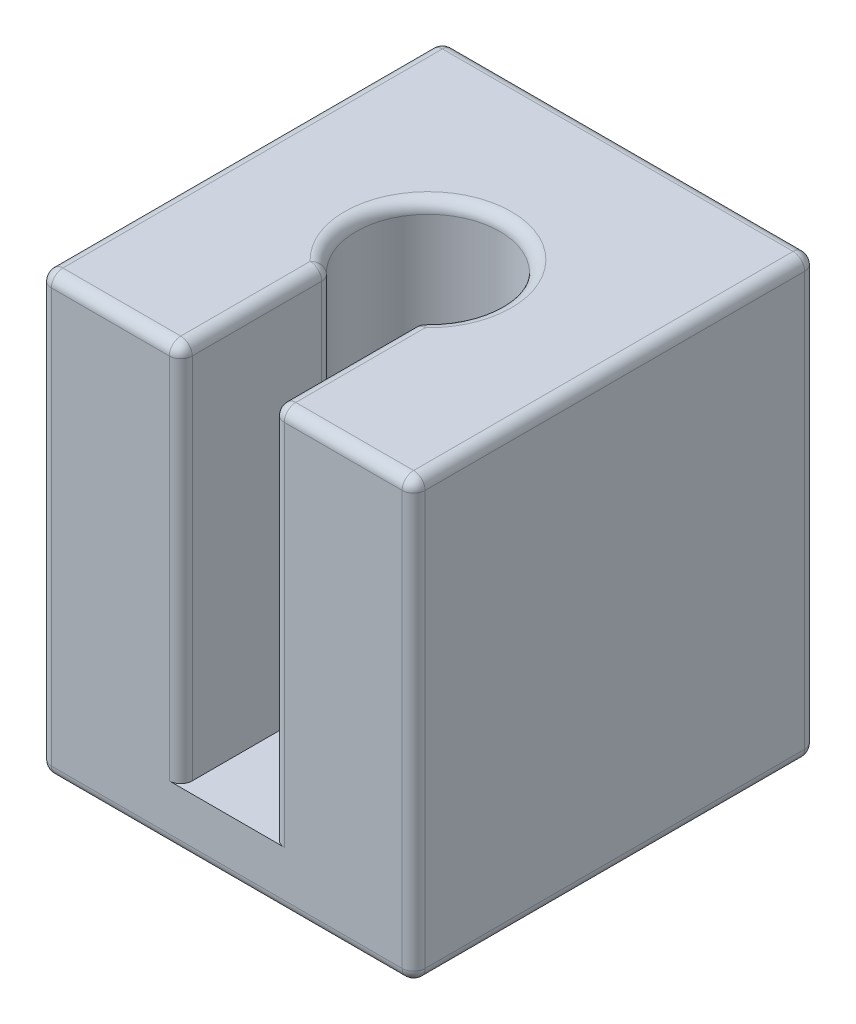
ISO-10303-21;
HEADER;
FILE_DESCRIPTION(('STEP AP214'),'2;1');
FILE_NAME('part.step','',(''),(''),'','','');
FILE_SCHEMA(('AUTOMOTIVE_DESIGN { 1 0 10303 214 1 1 1 1 }'));
ENDSEC;
DATA;
#1=APPLICATION_CONTEXT('core data for automotive mechanical design processes');
#2=APPLICATION_PROTOCOL_DEFINITION('international standard','automotive_design',2000,#1);
#3=PRODUCT_CONTEXT('',#1,'mechanical');
#4=PRODUCT('Part','Part','',(#3));
#5=PRODUCT_RELATED_PRODUCT_CATEGORY('part','',(#4));
#6=PRODUCT_DEFINITION_FORMATION('','',#4);
#7=PRODUCT_DEFINITION_CONTEXT('part definition',#1,'design');
#8=PRODUCT_DEFINITION('design','',#6,#7);
#9=PRODUCT_DEFINITION_SHAPE('','',#8);
#10=(LENGTH_UNIT() NAMED_UNIT(*) SI_UNIT(.MILLI.,.METRE.));
#11=(NAMED_UNIT(*) PLANE_ANGLE_UNIT() SI_UNIT($,.RADIAN.));
#12=(NAMED_UNIT(*) SI_UNIT($,.STERADIAN.) SOLID_ANGLE_UNIT());
#13=UNCERTAINTY_MEASURE_WITH_UNIT(LENGTH_MEASURE(1.E-05),#10,'distance_accuracy_value','');
#14=(GEOMETRIC_REPRESENTATION_CONTEXT(3) GLOBAL_UNCERTAINTY_ASSIGNED_CONTEXT((#13)) GLOBAL_UNIT_ASSIGNED_CONTEXT((#10,
#11,#12)) REPRESENTATION_CONTEXT('',''));
#15=CARTESIAN_POINT('',(0.,0.,0.));
#16=DIRECTION('',(0.,0.,1.));
#17=DIRECTION('',(1.,0.,0.));
#18=AXIS2_PLACEMENT_3D('',#15,#16,#17);
#19=CARTESIAN_POINT('',(0.,76.,0.));
#20=DIRECTION('',(1.,0.,0.));
#21=DIRECTION('',(0.,0.,-1.));
#22=AXIS2_PLACEMENT_3D('',#19,#20,#21);
#23=PLANE('',#22);
#24=DIRECTION('',(0.,-1.,0.));
#25=VECTOR('',#24,1.);
#26=CARTESIAN_POINT('',(0.,76.,-2.));
#27=LINE('',#26,#25);
#28=CARTESIAN_POINT('',(0.,2.,-2.));
#29=VERTEX_POINT('',#28);
#30=CARTESIAN_POINT('',(0.,74.,-2.));
#31=VERTEX_POINT('',#30);
#32=EDGE_CURVE('E289',#29,#31,#27,.F.);
#33=ORIENTED_EDGE('',*,*,#32,.T.);
#34=DIRECTION('',(0.,0.,1.));
#35=VECTOR('',#34,1.);
#36=CARTESIAN_POINT('',(0.,74.,0.));
#37=LINE('',#36,#35);
#38=CARTESIAN_POINT('',(0.,74.,-68.));
#39=VERTEX_POINT('',#38);
#40=EDGE_CURVE('E298',#31,#39,#37,.F.);
#41=ORIENTED_EDGE('',*,*,#40,.T.);
#42=DIRECTION('',(0.,-1.,0.));
#43=VECTOR('',#42,1.);
#44=CARTESIAN_POINT('',(0.,76.,-68.));
#45=LINE('',#44,#43);
#46=CARTESIAN_POINT('',(0.,2.,-68.));
#47=VERTEX_POINT('',#46);
#48=EDGE_CURVE('E295',#39,#47,#45,.T.);
#49=ORIENTED_EDGE('',*,*,#48,.T.);
#50=DIRECTION('',(0.,0.,1.));
#51=VECTOR('',#50,1.);
#52=CARTESIAN_POINT('',(0.,2.,0.));
#53=LINE('',#52,#51);
#54=EDGE_CURVE('E292',#47,#29,#53,.T.);
#55=ORIENTED_EDGE('',*,*,#54,.T.);
#56=EDGE_LOOP('',(#33,#41,#49,#55));
#57=FACE_BOUND('',#56,.T.);
#58=ADVANCED_FACE('F45',(#57),#23,.F.);
#59=CARTESIAN_POINT('',(0.,76.,0.));
#60=DIRECTION('',(0.,0.,-1.));
#61=DIRECTION('',(-1.,0.,0.));
#62=AXIS2_PLACEMENT_3D('',#59,#60,#61);
#63=PLANE('',#62);
#64=DIRECTION('',(1.,0.,0.));
#65=VECTOR('',#64,1.);
#66=CARTESIAN_POINT('',(24.5,9.99999999999999,0.));
#67=LINE('',#66,#65);
#68=CARTESIAN_POINT('',(22.5,9.99999999999999,0.));
#69=VERTEX_POINT('',#68);
#70=CARTESIAN_POINT('',(42.5,9.99999999999999,0.));
#71=VERTEX_POINT('',#70);
#72=EDGE_CURVE('E223',#69,#71,#67,.T.);
#73=ORIENTED_EDGE('',*,*,#72,.F.);
#74=DIRECTION('',(0.,1.,0.));
#75=VECTOR('',#74,1.);
#76=CARTESIAN_POINT('',(22.5,76.,0.));
#77=LINE('',#76,#75);
#78=CARTESIAN_POINT('',(22.5,74.,0.));
#79=VERTEX_POINT('',#78);
#80=EDGE_CURVE('E286',#69,#79,#77,.T.);
#81=ORIENTED_EDGE('',*,*,#80,.T.);
#82=DIRECTION('',(1.,0.,0.));
#83=VECTOR('',#82,1.);
#84=CARTESIAN_POINT('',(0.,74.,0.));
#85=LINE('',#84,#83);
#86=CARTESIAN_POINT('',(2.,74.,0.));
#87=VERTEX_POINT('',#86);
#88=EDGE_CURVE('E279',#79,#87,#85,.F.);
#89=ORIENTED_EDGE('',*,*,#88,.T.);
#90=DIRECTION('',(0.,-1.,0.));
#91=VECTOR('',#90,1.);
#92=CARTESIAN_POINT('',(2.,76.,0.));
#93=LINE('',#92,#91);
#94=CARTESIAN_POINT('',(2.,2.,0.));
#95=VERTEX_POINT('',#94);
#96=EDGE_CURVE('E273',#87,#95,#93,.T.);
#97=ORIENTED_EDGE('',*,*,#96,.T.);
#98=DIRECTION('',(1.,0.,0.));
#99=VECTOR('',#98,1.);
#100=CARTESIAN_POINT('',(65.,2.,0.));
#101=LINE('',#100,#99);
#102=CARTESIAN_POINT('',(63.,2.,0.));
#103=VERTEX_POINT('',#102);
#104=EDGE_CURVE('E269',#95,#103,#101,.T.);
#105=ORIENTED_EDGE('',*,*,#104,.T.);
#106=DIRECTION('',(0.,-1.,0.));
#107=VECTOR('',#106,1.);
#108=CARTESIAN_POINT('',(63.,76.,0.));
#109=LINE('',#108,#107);
#110=CARTESIAN_POINT('',(63.,74.,0.));
#111=VERTEX_POINT('',#110);
#112=EDGE_CURVE('E266',#103,#111,#109,.F.);
#113=ORIENTED_EDGE('',*,*,#112,.T.);
#114=DIRECTION('',(1.,0.,0.));
#115=VECTOR('',#114,1.);
#116=CARTESIAN_POINT('',(0.,74.,0.));
#117=LINE('',#116,#115);
#118=CARTESIAN_POINT('',(42.5,74.,0.));
#119=VERTEX_POINT('',#118);
#120=EDGE_CURVE('E276',#111,#119,#117,.F.);
#121=ORIENTED_EDGE('',*,*,#120,.T.);
#122=DIRECTION('',(0.,1.,0.));
#123=VECTOR('',#122,1.);
#124=CARTESIAN_POINT('',(42.5,76.,0.));
#125=LINE('',#124,#123);
#126=EDGE_CURVE('E282',#119,#71,#125,.F.);
#127=ORIENTED_EDGE('',*,*,#126,.T.);
#128=EDGE_LOOP('',(#73,#81,#89,#97,#105,#113,#121,#127));
#129=FACE_BOUND('',#128,.T.);
#130=ADVANCED_FACE('F558',(#129),#63,.F.);
#131=CARTESIAN_POINT('',(65.,76.,0.));
#132=DIRECTION('',(-1.,0.,0.));
#133=DIRECTION('',(0.,0.,1.));
#134=AXIS2_PLACEMENT_3D('',#131,#132,#133);
#135=PLANE('',#134);
#136=DIRECTION('',(0.,-1.,0.));
#137=VECTOR('',#136,1.);
#138=CARTESIAN_POINT('',(65.,76.,-2.));
#139=LINE('',#138,#137);
#140=CARTESIAN_POINT('',(65.,74.,-2.));
#141=VERTEX_POINT('',#140);
#142=CARTESIAN_POINT('',(65.,2.,-2.));
#143=VERTEX_POINT('',#142);
#144=EDGE_CURVE('E302',#141,#143,#139,.T.);
#145=ORIENTED_EDGE('',*,*,#144,.T.);
#146=DIRECTION('',(0.,0.,-1.));
#147=VECTOR('',#146,1.);
#148=CARTESIAN_POINT('',(65.,2.,-68.));
#149=LINE('',#148,#147);
#150=CARTESIAN_POINT('',(65.,2.,-68.));
#151=VERTEX_POINT('',#150);
#152=EDGE_CURVE('E55',#143,#151,#149,.T.);
#153=ORIENTED_EDGE('',*,*,#152,.T.);
#154=DIRECTION('',(0.,-1.,0.));
#155=VECTOR('',#154,1.);
#156=CARTESIAN_POINT('',(65.,76.,-68.));
#157=LINE('',#156,#155);
#158=CARTESIAN_POINT('',(65.,74.,-68.));
#159=VERTEX_POINT('',#158);
#160=EDGE_CURVE('E309',#151,#159,#157,.F.);
#161=ORIENTED_EDGE('',*,*,#160,.T.);
#162=DIRECTION('',(0.,0.,-1.));
#163=VECTOR('',#162,1.);
#164=CARTESIAN_POINT('',(65.,74.,0.));
#165=LINE('',#164,#163);
#166=EDGE_CURVE('E305',#159,#141,#165,.F.);
#167=ORIENTED_EDGE('',*,*,#166,.T.);
#168=EDGE_LOOP('',(#145,#153,#161,#167));
#169=FACE_BOUND('',#168,.T.);
#170=ADVANCED_FACE('F564',(#169),#135,.F.);
#171=CARTESIAN_POINT('',(0.,76.,-70.));
#172=DIRECTION('',(0.,0.,1.));
#173=DIRECTION('',(1.,0.,0.));
#174=AXIS2_PLACEMENT_3D('',#171,#172,#173);
#175=PLANE('',#174);
#176=DIRECTION('',(-1.,0.,0.));
#177=VECTOR('',#176,1.);
#178=CARTESIAN_POINT('',(0.,74.,-70.));
#179=LINE('',#178,#177);
#180=CARTESIAN_POINT('',(2.,74.,-70.));
#181=VERTEX_POINT('',#180);
#182=CARTESIAN_POINT('',(63.,74.,-70.));
#183=VERTEX_POINT('',#182);
#184=EDGE_CURVE('E336',#181,#183,#179,.F.);
#185=ORIENTED_EDGE('',*,*,#184,.T.);
#186=DIRECTION('',(0.,-1.,0.));
#187=VECTOR('',#186,1.);
#188=CARTESIAN_POINT('',(63.,76.,-70.));
#189=LINE('',#188,#187);
#190=CARTESIAN_POINT('',(63.,2.,-70.));
#191=VERTEX_POINT('',#190);
#192=EDGE_CURVE('E339',#183,#191,#189,.T.);
#193=ORIENTED_EDGE('',*,*,#192,.T.);
#194=DIRECTION('',(-1.,0.,0.));
#195=VECTOR('',#194,1.);
#196=CARTESIAN_POINT('',(0.,2.,-70.));
#197=LINE('',#196,#195);
#198=CARTESIAN_POINT('',(2.,2.,-70.));
#199=VERTEX_POINT('',#198);
#200=EDGE_CURVE('E330',#191,#199,#197,.T.);
#201=ORIENTED_EDGE('',*,*,#200,.T.);
#202=DIRECTION('',(0.,-1.,0.));
#203=VECTOR('',#202,1.);
#204=CARTESIAN_POINT('',(2.,76.,-70.));
#205=LINE('',#204,#203);
#206=EDGE_CURVE('E333',#199,#181,#205,.F.);
#207=ORIENTED_EDGE('',*,*,#206,.T.);
#208=EDGE_LOOP('',(#185,#193,#201,#207));
#209=FACE_BOUND('',#208,.T.);
#210=ADVANCED_FACE('F509',(#209),#175,.F.);
#211=CARTESIAN_POINT('',(0.,76.,0.));
#212=DIRECTION('',(0.,-1.,0.));
#213=DIRECTION('',(0.,0.,-1.));
#214=AXIS2_PLACEMENT_3D('',#211,#212,#213);
#215=PLANE('',#214);
#216=DIRECTION('',(0.,0.,-1.));
#217=VECTOR('',#216,1.);
#218=CARTESIAN_POINT('',(42.5,76.,0.));
#219=LINE('',#218,#217);
#220=CARTESIAN_POINT('',(42.5,76.,-24.5000000000007));
#221=VERTEX_POINT('',#220);
#222=CARTESIAN_POINT('',(42.5,76.,-2.));
#223=VERTEX_POINT('',#222);
#224=EDGE_CURVE('E260',#221,#223,#219,.F.);
#225=ORIENTED_EDGE('',*,*,#224,.T.);
#226=DIRECTION('',(1.,0.,0.));
#227=VECTOR('',#226,1.);
#228=CARTESIAN_POINT('',(0.,76.,-2.));
#229=LINE('',#228,#227);
#230=CARTESIAN_POINT('',(63.,76.,-2.));
#231=VERTEX_POINT('',#230);
#232=EDGE_CURVE('E263',#223,#231,#229,.T.);
#233=ORIENTED_EDGE('',*,*,#232,.T.);
#234=DIRECTION('',(0.,0.,-1.));
#235=VECTOR('',#234,1.);
#236=CARTESIAN_POINT('',(63.,76.,0.));
#237=LINE('',#236,#235);
#238=CARTESIAN_POINT('',(63.,76.,-68.));
#239=VERTEX_POINT('',#238);
#240=EDGE_CURVE('E244',#231,#239,#237,.T.);
#241=ORIENTED_EDGE('',*,*,#240,.T.);
#242=DIRECTION('',(-1.,0.,0.));
#243=VECTOR('',#242,1.);
#244=CARTESIAN_POINT('',(0.,76.,-68.));
#245=LINE('',#244,#243);
#246=CARTESIAN_POINT('',(2.,76.,-68.));
#247=VERTEX_POINT('',#246);
#248=EDGE_CURVE('E241',#239,#247,#245,.T.);
#249=ORIENTED_EDGE('',*,*,#248,.T.);
#250=DIRECTION('',(0.,0.,1.));
#251=VECTOR('',#250,1.);
#252=CARTESIAN_POINT('',(2.,76.,0.));
#253=LINE('',#252,#251);
#254=CARTESIAN_POINT('',(2.,76.,-2.));
#255=VERTEX_POINT('',#254);
#256=EDGE_CURVE('E247',#247,#255,#253,.T.);
#257=ORIENTED_EDGE('',*,*,#256,.T.);
#258=DIRECTION('',(1.,0.,0.));
#259=VECTOR('',#258,1.);
#260=CARTESIAN_POINT('',(0.,76.,-2.));
#261=LINE('',#260,#259);
#262=CARTESIAN_POINT('',(22.5,76.,-2.));
#263=VERTEX_POINT('',#262);
#264=EDGE_CURVE('E250',#255,#263,#261,.T.);
#265=ORIENTED_EDGE('',*,*,#264,.T.);
#266=DIRECTION('',(0.,0.,1.));
#267=VECTOR('',#266,1.);
#268=CARTESIAN_POINT('',(22.5,76.,0.));
#269=LINE('',#268,#267);
#270=CARTESIAN_POINT('',(22.5,76.,-24.4999999999996));
#271=VERTEX_POINT('',#270);
#272=EDGE_CURVE('E253',#263,#271,#269,.F.);
#273=ORIENTED_EDGE('',*,*,#272,.T.);
#274=CARTESIAN_POINT('',(32.4999999999994,76.,-34.9999999999983));
#275=DIRECTION('',(0.,-1.,0.));
#276=DIRECTION('',(0.,0.,-1.));
#277=AXIS2_PLACEMENT_3D('',#274,#275,#276);
#278=CIRCLE('',#277,14.4999999999987);
#279=EDGE_CURVE('E257',#271,#221,#278,.T.);
#280=ORIENTED_EDGE('',*,*,#279,.T.);
#281=EDGE_LOOP('',(#225,#233,#241,#249,#257,#265,#273,#280));
#282=FACE_BOUND('',#281,.T.);
#283=ADVANCED_FACE('F531',(#282),#215,.F.);
#284=CARTESIAN_POINT('',(0.,0.,0.));
#285=DIRECTION('',(0.,-1.,0.));
#286=DIRECTION('',(0.,0.,-1.));
#287=AXIS2_PLACEMENT_3D('',#284,#285,#286);
#288=PLANE('',#287);
#289=DIRECTION('',(-1.,0.,0.));
#290=VECTOR('',#289,1.);
#291=CARTESIAN_POINT('',(65.,0.,-68.));
#292=LINE('',#291,#290);
#293=CARTESIAN_POINT('',(2.,0.,-68.));
#294=VERTEX_POINT('',#293);
#295=CARTESIAN_POINT('',(63.,0.,-68.));
#296=VERTEX_POINT('',#295);
#297=EDGE_CURVE('E349',#294,#296,#292,.F.);
#298=ORIENTED_EDGE('',*,*,#297,.T.);
#299=DIRECTION('',(0.,0.,-1.));
#300=VECTOR('',#299,1.);
#301=CARTESIAN_POINT('',(63.,0.,-2.));
#302=LINE('',#301,#300);
#303=CARTESIAN_POINT('',(63.,0.,-2.));
#304=VERTEX_POINT('',#303);
#305=EDGE_CURVE('E11',#296,#304,#302,.F.);
#306=ORIENTED_EDGE('',*,*,#305,.T.);
#307=DIRECTION('',(1.,0.,0.));
#308=VECTOR('',#307,1.);
#309=CARTESIAN_POINT('',(0.,0.,-2.));
#310=LINE('',#309,#308);
#311=CARTESIAN_POINT('',(2.,0.,-2.));
#312=VERTEX_POINT('',#311);
#313=EDGE_CURVE('E343',#304,#312,#310,.F.);
#314=ORIENTED_EDGE('',*,*,#313,.T.);
#315=DIRECTION('',(0.,0.,1.));
#316=VECTOR('',#315,1.);
#317=CARTESIAN_POINT('',(2.,0.,-70.));
#318=LINE('',#317,#316);
#319=EDGE_CURVE('E346',#312,#294,#318,.F.);
#320=ORIENTED_EDGE('',*,*,#319,.T.);
#321=EDGE_LOOP('',(#298,#306,#314,#320));
#322=FACE_BOUND('',#321,.T.);
#323=ADVANCED_FACE('F668',(#322),#288,.T.);
#324=CARTESIAN_POINT('',(32.4999999999994,9.99999999999999,-34.9999999999983));
#325=DIRECTION('',(0.,1.,0.));
#326=DIRECTION('',(0.,0.,1.));
#327=AXIS2_PLACEMENT_3D('',#324,#325,#326);
#328=CYLINDRICAL_SURFACE('',#327,12.4999999999987);
#329=CARTESIAN_POINT('',(32.4999999999994,9.99999999999999,-34.9999999999983));
#330=DIRECTION('',(0.,1.,0.));
#331=DIRECTION('',(0.,0.,1.));
#332=AXIS2_PLACEMENT_3D('',#329,#330,#331);
#333=CIRCLE('',#332,12.4999999999987);
#334=CARTESIAN_POINT('',(41.1206896551722,9.99999999999999,-25.9482758620694));
#335=VERTEX_POINT('',#334);
#336=CARTESIAN_POINT('',(23.8793103448276,9.99999999999999,-25.9482758620685));
#337=VERTEX_POINT('',#336);
#338=EDGE_CURVE('E207',#335,#337,#333,.T.);
#339=ORIENTED_EDGE('',*,*,#338,.F.);
#340=DIRECTION('',(0.,1.,0.));
#341=VECTOR('',#340,1.);
#342=CARTESIAN_POINT('',(41.1206896551722,9.99999999999999,-25.9482758620694));
#343=LINE('',#342,#341);
#344=CARTESIAN_POINT('',(41.1206896551722,74.,-25.9482758620694));
#345=VERTEX_POINT('',#344);
#346=EDGE_CURVE('E327',#335,#345,#343,.T.);
#347=ORIENTED_EDGE('',*,*,#346,.T.);
#348=CARTESIAN_POINT('',(32.4999999999994,74.,-34.9999999999983));
#349=DIRECTION('',(0.,-1.,0.));
#350=DIRECTION('',(0.,0.,-1.));
#351=AXIS2_PLACEMENT_3D('',#348,#349,#350);
#352=CIRCLE('',#351,12.4999999999987);
#353=CARTESIAN_POINT('',(23.8793103448276,74.,-25.9482758620685));
#354=VERTEX_POINT('',#353);
#355=EDGE_CURVE('E324',#345,#354,#352,.F.);
#356=ORIENTED_EDGE('',*,*,#355,.T.);
#357=DIRECTION('',(0.,1.,0.));
#358=VECTOR('',#357,1.);
#359=CARTESIAN_POINT('',(23.8793103448276,9.99999999999999,-25.9482758620685));
#360=LINE('',#359,#358);
#361=EDGE_CURVE('E321',#354,#337,#360,.F.);
#362=ORIENTED_EDGE('',*,*,#361,.T.);
#363=EDGE_LOOP('',(#339,#347,#356,#362));
#364=FACE_BOUND('',#363,.T.);
#365=ADVANCED_FACE('F663',(#364),#328,.F.);
#366=CARTESIAN_POINT('',(40.5,9.99999999999999,0.));
#367=DIRECTION('',(1.,0.,0.));
#368=DIRECTION('',(0.,0.,-1.));
#369=AXIS2_PLACEMENT_3D('',#366,#367,#368);
#370=PLANE('',#369);
#371=DIRECTION('',(0.,0.,-1.));
#372=VECTOR('',#371,1.);
#373=CARTESIAN_POINT('',(40.5,9.99999999999999,0.));
#374=LINE('',#373,#372);
#375=CARTESIAN_POINT('',(40.5,9.99999999999999,-2.));
#376=VERTEX_POINT('',#375);
#377=CARTESIAN_POINT('',(40.5,9.99999999999999,-24.5000000000007));
#378=VERTEX_POINT('',#377);
#379=EDGE_CURVE('E231',#376,#378,#374,.T.);
#380=ORIENTED_EDGE('',*,*,#379,.F.);
#381=DIRECTION('',(0.,1.,0.));
#382=VECTOR('',#381,1.);
#383=CARTESIAN_POINT('',(40.5,9.99999999999999,-2.));
#384=LINE('',#383,#382);
#385=CARTESIAN_POINT('',(40.5,74.,-2.));
#386=VERTEX_POINT('',#385);
#387=EDGE_CURVE('E318',#376,#386,#384,.T.);
#388=ORIENTED_EDGE('',*,*,#387,.T.);
#389=DIRECTION('',(0.,0.,-1.));
#390=VECTOR('',#389,1.);
#391=CARTESIAN_POINT('',(40.5,74.,0.));
#392=LINE('',#391,#390);
#393=CARTESIAN_POINT('',(40.5,74.,-24.5000000000007));
#394=VERTEX_POINT('',#393);
#395=EDGE_CURVE('E315',#386,#394,#392,.T.);
#396=ORIENTED_EDGE('',*,*,#395,.T.);
#397=DIRECTION('',(0.,1.,0.));
#398=VECTOR('',#397,1.);
#399=CARTESIAN_POINT('',(40.5,9.99999999999999,-24.5000000000007));
#400=LINE('',#399,#398);
#401=EDGE_CURVE('E312',#394,#378,#400,.F.);
#402=ORIENTED_EDGE('',*,*,#401,.T.);
#403=EDGE_LOOP('',(#380,#388,#396,#402));
#404=FACE_BOUND('',#403,.T.);
#405=ADVANCED_FACE('F651',(#404),#370,.F.);
#406=CARTESIAN_POINT('',(24.5,9.99999999999999,0.));
#407=DIRECTION('',(-1.,0.,0.));
#408=DIRECTION('',(0.,0.,1.));
#409=AXIS2_PLACEMENT_3D('',#406,#407,#408);
#410=PLANE('',#409);
#411=DIRECTION('',(0.,0.,1.));
#412=VECTOR('',#411,1.);
#413=CARTESIAN_POINT('',(24.5,74.,0.));
#414=LINE('',#413,#412);
#415=CARTESIAN_POINT('',(24.5,74.,-24.4999999999996));
#416=VERTEX_POINT('',#415);
#417=CARTESIAN_POINT('',(24.5,74.,-2.));
#418=VERTEX_POINT('',#417);
#419=EDGE_CURVE('E230',#416,#418,#414,.T.);
#420=ORIENTED_EDGE('',*,*,#419,.T.);
#421=DIRECTION('',(0.,1.,0.));
#422=VECTOR('',#421,1.);
#423=CARTESIAN_POINT('',(24.5,9.99999999999999,-2.));
#424=LINE('',#423,#422);
#425=CARTESIAN_POINT('',(24.5,9.99999999999999,-2.));
#426=VERTEX_POINT('',#425);
#427=EDGE_CURVE('E221',#418,#426,#424,.F.);
#428=ORIENTED_EDGE('',*,*,#427,.T.);
#429=DIRECTION('',(0.,0.,1.));
#430=VECTOR('',#429,1.);
#431=CARTESIAN_POINT('',(24.5,9.99999999999999,0.));
#432=LINE('',#431,#430);
#433=CARTESIAN_POINT('',(24.5,9.99999999999999,-24.4999999999996));
#434=VERTEX_POINT('',#433);
#435=EDGE_CURVE('E204',#434,#426,#432,.T.);
#436=ORIENTED_EDGE('',*,*,#435,.F.);
#437=DIRECTION('',(0.,1.,0.));
#438=VECTOR('',#437,1.);
#439=CARTESIAN_POINT('',(24.5,9.99999999999999,-24.4999999999996));
#440=LINE('',#439,#438);
#441=EDGE_CURVE('E218',#434,#416,#440,.T.);
#442=ORIENTED_EDGE('',*,*,#441,.T.);
#443=EDGE_LOOP('',(#420,#428,#436,#442));
#444=FACE_BOUND('',#443,.T.);
#445=ADVANCED_FACE('F217',(#444),#410,.F.);
#446=CARTESIAN_POINT('',(32.4999999999994,9.99999999999999,-34.9999999999983));
#447=DIRECTION('',(0.,1.,0.));
#448=DIRECTION('',(0.,0.,1.));
#449=AXIS2_PLACEMENT_3D('',#446,#447,#448);
#450=PLANE('',#449);
#451=ORIENTED_EDGE('',*,*,#379,.T.);
#452=CARTESIAN_POINT('',(42.5,9.99999999999999,-24.5000000000007));
#453=DIRECTION('',(0.,1.,0.));
#454=DIRECTION('',(0.,0.,1.));
#455=AXIS2_PLACEMENT_3D('',#452,#453,#454);
#456=CIRCLE('',#455,2.);
#457=EDGE_CURVE('E213',#378,#335,#456,.F.);
#458=ORIENTED_EDGE('',*,*,#457,.T.);
#459=ORIENTED_EDGE('',*,*,#338,.T.);
#460=CARTESIAN_POINT('',(22.5,9.99999999999999,-24.4999999999996));
#461=DIRECTION('',(0.,1.,0.));
#462=DIRECTION('',(0.,0.,1.));
#463=AXIS2_PLACEMENT_3D('',#460,#461,#462);
#464=CIRCLE('',#463,2.);
#465=EDGE_CURVE('E199',#337,#434,#464,.F.);
#466=ORIENTED_EDGE('',*,*,#465,.T.);
#467=ORIENTED_EDGE('',*,*,#435,.T.);
#468=CARTESIAN_POINT('',(22.5,9.99999999999999,-2.));
#469=DIRECTION('',(0.,1.,0.));
#470=DIRECTION('',(0.,0.,1.));
#471=AXIS2_PLACEMENT_3D('',#468,#469,#470);
#472=CIRCLE('',#471,2.);
#473=EDGE_CURVE('E352',#426,#69,#472,.F.);
#474=ORIENTED_EDGE('',*,*,#473,.T.);
#475=ORIENTED_EDGE('',*,*,#72,.T.);
#476=CARTESIAN_POINT('',(42.5,9.99999999999999,-2.));
#477=DIRECTION('',(0.,1.,0.));
#478=DIRECTION('',(0.,0.,1.));
#479=AXIS2_PLACEMENT_3D('',#476,#477,#478);
#480=CIRCLE('',#479,2.);
#481=EDGE_CURVE('E355',#71,#376,#480,.F.);
#482=ORIENTED_EDGE('',*,*,#481,.T.);
#483=EDGE_LOOP('',(#451,#458,#459,#466,#467,#474,#475,#482));
#484=FACE_BOUND('',#483,.T.);
#485=ADVANCED_FACE('F202',(#484),#450,.T.);
#486=CARTESIAN_POINT('',(0.,2.,-68.));
#487=DIRECTION('',(1.,0.,0.));
#488=DIRECTION('',(0.,0.,-1.));
#489=AXIS2_PLACEMENT_3D('',#486,#487,#488);
#490=CYLINDRICAL_SURFACE('',#489,2.);
#491=ORIENTED_EDGE('',*,*,#200,.F.);
#492=CARTESIAN_POINT('',(63.,2.,-68.));
#493=DIRECTION('',(1.,0.,0.));
#494=DIRECTION('',(0.,0.,-1.));
#495=AXIS2_PLACEMENT_3D('',#492,#493,#494);
#496=CIRCLE('',#495,2.);
#497=EDGE_CURVE('E63',#191,#296,#496,.F.);
#498=ORIENTED_EDGE('',*,*,#497,.T.);
#499=ORIENTED_EDGE('',*,*,#297,.F.);
#500=CARTESIAN_POINT('',(2.,2.,-68.));
#501=DIRECTION('',(-1.,0.,0.));
#502=DIRECTION('',(0.,0.,1.));
#503=AXIS2_PLACEMENT_3D('',#500,#501,#502);
#504=CIRCLE('',#503,2.);
#505=EDGE_CURVE('E463',#199,#294,#504,.T.);
#506=ORIENTED_EDGE('',*,*,#505,.F.);
#507=EDGE_LOOP('',(#491,#498,#499,#506));
#508=FACE_BOUND('',#507,.T.);
#509=ADVANCED_FACE('F506',(#508),#490,.T.);
#510=CARTESIAN_POINT('',(63.,76.,-68.));
#511=DIRECTION('',(0.,-1.,0.));
#512=DIRECTION('',(0.,0.,-1.));
#513=AXIS2_PLACEMENT_3D('',#510,#511,#512);
#514=CYLINDRICAL_SURFACE('',#513,2.);
#515=ORIENTED_EDGE('',*,*,#160,.F.);
#516=CARTESIAN_POINT('',(63.,2.,-68.));
#517=DIRECTION('',(0.,-1.,0.));
#518=DIRECTION('',(0.,0.,-1.));
#519=AXIS2_PLACEMENT_3D('',#516,#517,#518);
#520=CIRCLE('',#519,2.);
#521=EDGE_CURVE('E481',#151,#191,#520,.F.);
#522=ORIENTED_EDGE('',*,*,#521,.T.);
#523=ORIENTED_EDGE('',*,*,#192,.F.);
#524=CARTESIAN_POINT('',(63.,74.,-68.));
#525=DIRECTION('',(0.,1.,0.));
#526=DIRECTION('',(0.,0.,1.));
#527=AXIS2_PLACEMENT_3D('',#524,#525,#526);
#528=CIRCLE('',#527,2.);
#529=EDGE_CURVE('E459',#159,#183,#528,.T.);
#530=ORIENTED_EDGE('',*,*,#529,.F.);
#531=EDGE_LOOP('',(#515,#522,#523,#530));
#532=FACE_BOUND('',#531,.T.);
#533=ADVANCED_FACE('F503',(#532),#514,.T.);
#534=CARTESIAN_POINT('',(63.,74.,0.));
#535=DIRECTION('',(0.,0.,-1.));
#536=DIRECTION('',(-1.,0.,0.));
#537=AXIS2_PLACEMENT_3D('',#534,#535,#536);
#538=CYLINDRICAL_SURFACE('',#537,2.);
#539=CARTESIAN_POINT('',(63.,74.,-2.));
#540=DIRECTION('',(0.,0.,1.));
#541=DIRECTION('',(1.,0.,0.));
#542=AXIS2_PLACEMENT_3D('',#539,#540,#541);
#543=CIRCLE('',#542,2.);
#544=EDGE_CURVE('E471',#141,#231,#543,.T.);
#545=ORIENTED_EDGE('',*,*,#544,.F.);
#546=ORIENTED_EDGE('',*,*,#166,.F.);
#547=CARTESIAN_POINT('',(63.,74.,-68.));
#548=DIRECTION('',(0.,0.,-1.));
#549=DIRECTION('',(-1.,0.,0.));
#550=AXIS2_PLACEMENT_3D('',#547,#548,#549);
#551=CIRCLE('',#550,2.);
#552=EDGE_CURVE('E455',#239,#159,#551,.T.);
#553=ORIENTED_EDGE('',*,*,#552,.F.);
#554=ORIENTED_EDGE('',*,*,#240,.F.);
#555=EDGE_LOOP('',(#545,#546,#553,#554));
#556=FACE_BOUND('',#555,.T.);
#557=ADVANCED_FACE('F540',(#556),#538,.T.);
#558=CARTESIAN_POINT('',(63.,74.,-2.));
#559=DIRECTION('',(1.,0.,0.));
#560=DIRECTION('',(0.,0.,-1.));
#561=AXIS2_PLACEMENT_3D('',#558,#559,#560);
#562=SPHERICAL_SURFACE('',#561,2.);
#563=CARTESIAN_POINT('',(63.,74.,-2.));
#564=DIRECTION('',(1.,0.,0.));
#565=DIRECTION('',(0.,0.,-1.));
#566=AXIS2_PLACEMENT_3D('',#563,#564,#565);
#567=CIRCLE('',#566,2.);
#568=EDGE_CURVE('E451',#111,#231,#567,.F.);
#569=ORIENTED_EDGE('',*,*,#568,.F.);
#570=CARTESIAN_POINT('',(63.,74.,-2.));
#571=DIRECTION('',(0.,1.,0.));
#572=DIRECTION('',(0.,0.,1.));
#573=AXIS2_PLACEMENT_3D('',#570,#571,#572);
#574=CIRCLE('',#573,2.);
#575=EDGE_CURVE('E467',#141,#111,#574,.F.);
#576=ORIENTED_EDGE('',*,*,#575,.F.);
#577=ORIENTED_EDGE('',*,*,#544,.T.);
#578=EDGE_LOOP('',(#569,#576,#577));
#579=FACE_BOUND('',#578,.T.);
#580=ADVANCED_FACE('F690',(#579),#562,.T.);
#581=CARTESIAN_POINT('',(63.,76.,-2.));
#582=DIRECTION('',(0.,-1.,0.));
#583=DIRECTION('',(0.,0.,-1.));
#584=AXIS2_PLACEMENT_3D('',#581,#582,#583);
#585=CYLINDRICAL_SURFACE('',#584,2.);
#586=ORIENTED_EDGE('',*,*,#112,.F.);
#587=CARTESIAN_POINT('',(63.,2.,-2.));
#588=DIRECTION('',(0.,-1.,0.));
#589=DIRECTION('',(0.,0.,-1.));
#590=AXIS2_PLACEMENT_3D('',#587,#588,#589);
#591=CIRCLE('',#590,2.);
#592=EDGE_CURVE('E478',#103,#143,#591,.F.);
#593=ORIENTED_EDGE('',*,*,#592,.T.);
#594=ORIENTED_EDGE('',*,*,#144,.F.);
#595=ORIENTED_EDGE('',*,*,#575,.T.);
#596=EDGE_LOOP('',(#586,#593,#594,#595));
#597=FACE_BOUND('',#596,.T.);
#598=ADVANCED_FACE('F554',(#597),#585,.T.);
#599=CARTESIAN_POINT('',(2.,2.,-68.));
#600=DIRECTION('',(0.,-1.,0.));
#601=DIRECTION('',(0.,0.,-1.));
#602=AXIS2_PLACEMENT_3D('',#599,#600,#601);
#603=SPHERICAL_SURFACE('',#602,2.);
#604=CARTESIAN_POINT('',(2.,2.,-68.));
#605=DIRECTION('',(0.,-1.,0.));
#606=DIRECTION('',(0.,0.,-1.));
#607=AXIS2_PLACEMENT_3D('',#604,#605,#606);
#608=CIRCLE('',#607,2.);
#609=EDGE_CURVE('E443',#199,#47,#608,.F.);
#610=ORIENTED_EDGE('',*,*,#609,.F.);
#611=ORIENTED_EDGE('',*,*,#505,.T.);
#612=CARTESIAN_POINT('',(2.,2.,-68.));
#613=DIRECTION('',(0.,0.,-1.));
#614=DIRECTION('',(-1.,0.,0.));
#615=AXIS2_PLACEMENT_3D('',#612,#613,#614);
#616=CIRCLE('',#615,2.);
#617=EDGE_CURVE('E447',#47,#294,#616,.F.);
#618=ORIENTED_EDGE('',*,*,#617,.F.);
#619=EDGE_LOOP('',(#610,#611,#618));
#620=FACE_BOUND('',#619,.T.);
#621=ADVANCED_FACE('F545',(#620),#603,.T.);
#622=CARTESIAN_POINT('',(63.,74.,-68.));
#623=DIRECTION('',(1.,0.,0.));
#624=DIRECTION('',(0.,0.,-1.));
#625=AXIS2_PLACEMENT_3D('',#622,#623,#624);
#626=SPHERICAL_SURFACE('',#625,2.);
#627=ORIENTED_EDGE('',*,*,#552,.T.);
#628=ORIENTED_EDGE('',*,*,#529,.T.);
#629=CARTESIAN_POINT('',(63.,74.,-68.));
#630=DIRECTION('',(1.,0.,0.));
#631=DIRECTION('',(0.,0.,-1.));
#632=AXIS2_PLACEMENT_3D('',#629,#630,#631);
#633=CIRCLE('',#632,2.);
#634=EDGE_CURVE('E439',#239,#183,#633,.F.);
#635=ORIENTED_EDGE('',*,*,#634,.F.);
#636=EDGE_LOOP('',(#627,#628,#635));
#637=FACE_BOUND('',#636,.T.);
#638=ADVANCED_FACE('F542',(#637),#626,.T.);
#639=CARTESIAN_POINT('',(0.,74.,-2.));
#640=DIRECTION('',(1.,0.,0.));
#641=DIRECTION('',(0.,0.,-1.));
#642=AXIS2_PLACEMENT_3D('',#639,#640,#641);
#643=CYLINDRICAL_SURFACE('',#642,2.);
#644=ORIENTED_EDGE('',*,*,#568,.T.);
#645=ORIENTED_EDGE('',*,*,#232,.F.);
#646=CARTESIAN_POINT('',(42.5,74.,-2.));
#647=DIRECTION('',(-1.,0.,0.));
#648=DIRECTION('',(0.,0.,1.));
#649=AXIS2_PLACEMENT_3D('',#646,#647,#648);
#650=CIRCLE('',#649,2.);
#651=EDGE_CURVE('E435',#119,#223,#650,.T.);
#652=ORIENTED_EDGE('',*,*,#651,.F.);
#653=ORIENTED_EDGE('',*,*,#120,.F.);
#654=EDGE_LOOP('',(#644,#645,#652,#653));
#655=FACE_BOUND('',#654,.T.);
#656=ADVANCED_FACE('F544',(#655),#643,.T.);
#657=CARTESIAN_POINT('',(42.5,9.99999999999999,-2.));
#658=DIRECTION('',(0.,1.,0.));
#659=DIRECTION('',(0.,0.,1.));
#660=AXIS2_PLACEMENT_3D('',#657,#658,#659);
#661=CYLINDRICAL_SURFACE('',#660,2.);
#662=ORIENTED_EDGE('',*,*,#481,.F.);
#663=ORIENTED_EDGE('',*,*,#126,.F.);
#664=CARTESIAN_POINT('',(42.5,74.,-2.));
#665=DIRECTION('',(0.,1.,0.));
#666=DIRECTION('',(0.,0.,1.));
#667=AXIS2_PLACEMENT_3D('',#664,#665,#666);
#668=CIRCLE('',#667,2.);
#669=EDGE_CURVE('E431',#386,#119,#668,.T.);
#670=ORIENTED_EDGE('',*,*,#669,.F.);
#671=ORIENTED_EDGE('',*,*,#387,.F.);
#672=EDGE_LOOP('',(#662,#663,#670,#671));
#673=FACE_BOUND('',#672,.T.);
#674=ADVANCED_FACE('F551',(#673),#661,.T.);
#675=CARTESIAN_POINT('',(0.,2.,-2.));
#676=DIRECTION('',(-1.,0.,0.));
#677=DIRECTION('',(0.,0.,1.));
#678=AXIS2_PLACEMENT_3D('',#675,#676,#677);
#679=CYLINDRICAL_SURFACE('',#678,2.);
#680=ORIENTED_EDGE('',*,*,#313,.F.);
#681=CARTESIAN_POINT('',(63.,2.,-2.));
#682=DIRECTION('',(-1.,0.,0.));
#683=DIRECTION('',(0.,0.,1.));
#684=AXIS2_PLACEMENT_3D('',#681,#682,#683);
#685=CIRCLE('',#684,2.);
#686=EDGE_CURVE('E212',#304,#103,#685,.T.);
#687=ORIENTED_EDGE('',*,*,#686,.T.);
#688=ORIENTED_EDGE('',*,*,#104,.F.);
#689=CARTESIAN_POINT('',(2.,2.,-2.));
#690=DIRECTION('',(-1.,0.,0.));
#691=DIRECTION('',(0.,0.,1.));
#692=AXIS2_PLACEMENT_3D('',#689,#690,#691);
#693=CIRCLE('',#692,2.);
#694=EDGE_CURVE('E427',#312,#95,#693,.T.);
#695=ORIENTED_EDGE('',*,*,#694,.F.);
#696=EDGE_LOOP('',(#680,#687,#688,#695));
#697=FACE_BOUND('',#696,.T.);
#698=ADVANCED_FACE('F634',(#697),#679,.T.);
#699=CARTESIAN_POINT('',(2.,2.,0.));
#700=DIRECTION('',(0.,0.,-1.));
#701=DIRECTION('',(-1.,0.,0.));
#702=AXIS2_PLACEMENT_3D('',#699,#700,#701);
#703=CYLINDRICAL_SURFACE('',#702,2.);
#704=ORIENTED_EDGE('',*,*,#617,.T.);
#705=ORIENTED_EDGE('',*,*,#319,.F.);
#706=CARTESIAN_POINT('',(2.,2.,-2.));
#707=DIRECTION('',(0.,0.,1.));
#708=DIRECTION('',(1.,0.,0.));
#709=AXIS2_PLACEMENT_3D('',#706,#707,#708);
#710=CIRCLE('',#709,2.);
#711=EDGE_CURVE('E423',#29,#312,#710,.T.);
#712=ORIENTED_EDGE('',*,*,#711,.F.);
#713=ORIENTED_EDGE('',*,*,#54,.F.);
#714=EDGE_LOOP('',(#704,#705,#712,#713));
#715=FACE_BOUND('',#714,.T.);
#716=ADVANCED_FACE('F631',(#715),#703,.T.);
#717=CARTESIAN_POINT('',(2.,76.,-68.));
#718=DIRECTION('',(0.,-1.,0.));
#719=DIRECTION('',(0.,0.,-1.));
#720=AXIS2_PLACEMENT_3D('',#717,#718,#719);
#721=CYLINDRICAL_SURFACE('',#720,2.);
#722=ORIENTED_EDGE('',*,*,#609,.T.);
#723=ORIENTED_EDGE('',*,*,#48,.F.);
#724=CARTESIAN_POINT('',(2.,74.,-68.));
#725=DIRECTION('',(0.,1.,0.));
#726=DIRECTION('',(0.,0.,1.));
#727=AXIS2_PLACEMENT_3D('',#724,#725,#726);
#728=CIRCLE('',#727,2.);
#729=EDGE_CURVE('E419',#181,#39,#728,.T.);
#730=ORIENTED_EDGE('',*,*,#729,.F.);
#731=ORIENTED_EDGE('',*,*,#206,.F.);
#732=EDGE_LOOP('',(#722,#723,#730,#731));
#733=FACE_BOUND('',#732,.T.);
#734=ADVANCED_FACE('F521',(#733),#721,.T.);
#735=CARTESIAN_POINT('',(0.,74.,-68.));
#736=DIRECTION('',(-1.,0.,0.));
#737=DIRECTION('',(0.,0.,1.));
#738=AXIS2_PLACEMENT_3D('',#735,#736,#737);
#739=CYLINDRICAL_SURFACE('',#738,2.);
#740=ORIENTED_EDGE('',*,*,#634,.T.);
#741=ORIENTED_EDGE('',*,*,#184,.F.);
#742=CARTESIAN_POINT('',(2.,74.,-68.));
#743=DIRECTION('',(-1.,0.,0.));
#744=DIRECTION('',(0.,0.,1.));
#745=AXIS2_PLACEMENT_3D('',#742,#743,#744);
#746=CIRCLE('',#745,2.);
#747=EDGE_CURVE('E415',#247,#181,#746,.T.);
#748=ORIENTED_EDGE('',*,*,#747,.F.);
#749=ORIENTED_EDGE('',*,*,#248,.F.);
#750=EDGE_LOOP('',(#740,#741,#748,#749));
#751=FACE_BOUND('',#750,.T.);
#752=ADVANCED_FACE('F515',(#751),#739,.T.);
#753=CARTESIAN_POINT('',(42.5,74.,-2.));
#754=DIRECTION('',(0.,0.,1.));
#755=DIRECTION('',(1.,0.,0.));
#756=AXIS2_PLACEMENT_3D('',#753,#754,#755);
#757=SPHERICAL_SURFACE('',#756,2.);
#758=ORIENTED_EDGE('',*,*,#669,.T.);
#759=ORIENTED_EDGE('',*,*,#651,.T.);
#760=CARTESIAN_POINT('',(42.5,74.,-2.));
#761=DIRECTION('',(0.,0.,1.));
#762=DIRECTION('',(1.,0.,0.));
#763=AXIS2_PLACEMENT_3D('',#760,#761,#762);
#764=CIRCLE('',#763,2.);
#765=EDGE_CURVE('E411',#386,#223,#764,.F.);
#766=ORIENTED_EDGE('',*,*,#765,.F.);
#767=EDGE_LOOP('',(#758,#759,#766));
#768=FACE_BOUND('',#767,.T.);
#769=ADVANCED_FACE('F622',(#768),#757,.T.);
#770=CARTESIAN_POINT('',(2.,2.,-2.));
#771=DIRECTION('',(0.,-1.,0.));
#772=DIRECTION('',(0.,0.,-1.));
#773=AXIS2_PLACEMENT_3D('',#770,#771,#772);
#774=SPHERICAL_SURFACE('',#773,2.);
#775=ORIENTED_EDGE('',*,*,#711,.T.);
#776=ORIENTED_EDGE('',*,*,#694,.T.);
#777=CARTESIAN_POINT('',(2.,2.,-2.));
#778=DIRECTION('',(0.,-1.,0.));
#779=DIRECTION('',(0.,0.,-1.));
#780=AXIS2_PLACEMENT_3D('',#777,#778,#779);
#781=CIRCLE('',#780,2.);
#782=EDGE_CURVE('E407',#29,#95,#781,.F.);
#783=ORIENTED_EDGE('',*,*,#782,.F.);
#784=EDGE_LOOP('',(#775,#776,#783));
#785=FACE_BOUND('',#784,.T.);
#786=ADVANCED_FACE('F619',(#785),#774,.T.);
#787=CARTESIAN_POINT('',(2.,74.,-68.));
#788=DIRECTION('',(0.,0.,-1.));
#789=DIRECTION('',(-1.,0.,0.));
#790=AXIS2_PLACEMENT_3D('',#787,#788,#789);
#791=SPHERICAL_SURFACE('',#790,2.);
#792=ORIENTED_EDGE('',*,*,#747,.T.);
#793=ORIENTED_EDGE('',*,*,#729,.T.);
#794=CARTESIAN_POINT('',(2.,74.,-68.));
#795=DIRECTION('',(0.,0.,-1.));
#796=DIRECTION('',(-1.,0.,0.));
#797=AXIS2_PLACEMENT_3D('',#794,#795,#796);
#798=CIRCLE('',#797,2.);
#799=EDGE_CURVE('E404',#247,#39,#798,.F.);
#800=ORIENTED_EDGE('',*,*,#799,.F.);
#801=EDGE_LOOP('',(#792,#793,#800));
#802=FACE_BOUND('',#801,.T.);
#803=ADVANCED_FACE('F523',(#802),#791,.T.);
#804=CARTESIAN_POINT('',(42.5,74.,0.));
#805=DIRECTION('',(0.,0.,-1.));
#806=DIRECTION('',(-1.,0.,0.));
#807=AXIS2_PLACEMENT_3D('',#804,#805,#806);
#808=CYLINDRICAL_SURFACE('',#807,2.);
#809=ORIENTED_EDGE('',*,*,#765,.T.);
#810=ORIENTED_EDGE('',*,*,#224,.F.);
#811=CARTESIAN_POINT('',(42.5,74.,-24.5000000000007));
#812=DIRECTION('',(0.,0.,-1.));
#813=DIRECTION('',(-1.,0.,0.));
#814=AXIS2_PLACEMENT_3D('',#811,#812,#813);
#815=CIRCLE('',#814,2.);
#816=EDGE_CURVE('E400',#394,#221,#815,.T.);
#817=ORIENTED_EDGE('',*,*,#816,.F.);
#818=ORIENTED_EDGE('',*,*,#395,.F.);
#819=EDGE_LOOP('',(#809,#810,#817,#818));
#820=FACE_BOUND('',#819,.T.);
#821=ADVANCED_FACE('F612',(#820),#808,.T.);
#822=CARTESIAN_POINT('',(42.5,9.99999999999999,-24.5000000000007));
#823=DIRECTION('',(0.,1.,0.));
#824=DIRECTION('',(0.,0.,1.));
#825=AXIS2_PLACEMENT_3D('',#822,#823,#824);
#826=CYLINDRICAL_SURFACE('',#825,2.);
#827=ORIENTED_EDGE('',*,*,#457,.F.);
#828=ORIENTED_EDGE('',*,*,#401,.F.);
#829=CARTESIAN_POINT('',(42.5,74.,-24.5000000000007));
#830=DIRECTION('',(0.,1.,0.));
#831=DIRECTION('',(0.,0.,1.));
#832=AXIS2_PLACEMENT_3D('',#829,#830,#831);
#833=CIRCLE('',#832,2.);
#834=EDGE_CURVE('E396',#345,#394,#833,.T.);
#835=ORIENTED_EDGE('',*,*,#834,.F.);
#836=ORIENTED_EDGE('',*,*,#346,.F.);
#837=EDGE_LOOP('',(#827,#828,#835,#836));
#838=FACE_BOUND('',#837,.T.);
#839=ADVANCED_FACE('F608',(#838),#826,.T.);
#840=CARTESIAN_POINT('',(2.,76.,-2.));
#841=DIRECTION('',(0.,-1.,0.));
#842=DIRECTION('',(0.,0.,-1.));
#843=AXIS2_PLACEMENT_3D('',#840,#841,#842);
#844=CYLINDRICAL_SURFACE('',#843,2.);
#845=ORIENTED_EDGE('',*,*,#782,.T.);
#846=ORIENTED_EDGE('',*,*,#96,.F.);
#847=CARTESIAN_POINT('',(2.,74.,-2.));
#848=DIRECTION('',(0.,1.,0.));
#849=DIRECTION('',(0.,0.,1.));
#850=AXIS2_PLACEMENT_3D('',#847,#848,#849);
#851=CIRCLE('',#850,2.);
#852=EDGE_CURVE('E392',#31,#87,#851,.T.);
#853=ORIENTED_EDGE('',*,*,#852,.F.);
#854=ORIENTED_EDGE('',*,*,#32,.F.);
#855=EDGE_LOOP('',(#845,#846,#853,#854));
#856=FACE_BOUND('',#855,.T.);
#857=ADVANCED_FACE('F605',(#856),#844,.T.);
#858=CARTESIAN_POINT('',(2.,74.,0.));
#859=DIRECTION('',(0.,0.,1.));
#860=DIRECTION('',(1.,0.,0.));
#861=AXIS2_PLACEMENT_3D('',#858,#859,#860);
#862=CYLINDRICAL_SURFACE('',#861,2.);
#863=ORIENTED_EDGE('',*,*,#799,.T.);
#864=ORIENTED_EDGE('',*,*,#40,.F.);
#865=CARTESIAN_POINT('',(2.,74.,-2.));
#866=DIRECTION('',(0.,0.,1.));
#867=DIRECTION('',(1.,0.,0.));
#868=AXIS2_PLACEMENT_3D('',#865,#866,#867);
#869=CIRCLE('',#868,2.);
#870=EDGE_CURVE('E388',#255,#31,#869,.T.);
#871=ORIENTED_EDGE('',*,*,#870,.F.);
#872=ORIENTED_EDGE('',*,*,#256,.F.);
#873=EDGE_LOOP('',(#863,#864,#871,#872));
#874=FACE_BOUND('',#873,.T.);
#875=ADVANCED_FACE('F528',(#874),#862,.T.);
#876=CARTESIAN_POINT('',(42.5,74.,-24.5000000000007));
#877=DIRECTION('',(0.,1.,0.));
#878=DIRECTION('',(0.,0.,1.));
#879=AXIS2_PLACEMENT_3D('',#876,#877,#878);
#880=SPHERICAL_SURFACE('',#879,2.);
#881=ORIENTED_EDGE('',*,*,#834,.T.);
#882=ORIENTED_EDGE('',*,*,#816,.T.);
#883=CARTESIAN_POINT('',(42.5,74.,-24.5000000000007));
#884=DIRECTION('',(-0.724137931034385,0.,0.689655172413895));
#885=DIRECTION('',(0.689655172413895,0.,0.724137931034385));
#886=AXIS2_PLACEMENT_3D('',#883,#884,#885);
#887=CIRCLE('',#886,2.);
#888=EDGE_CURVE('E384',#345,#221,#887,.F.);
#889=ORIENTED_EDGE('',*,*,#888,.F.);
#890=EDGE_LOOP('',(#881,#882,#889));
#891=FACE_BOUND('',#890,.T.);
#892=ADVANCED_FACE('F598',(#891),#880,.T.);
#893=CARTESIAN_POINT('',(2.,74.,-2.));
#894=DIRECTION('',(-1.,0.,0.));
#895=DIRECTION('',(0.,0.,1.));
#896=AXIS2_PLACEMENT_3D('',#893,#894,#895);
#897=SPHERICAL_SURFACE('',#896,2.);
#898=ORIENTED_EDGE('',*,*,#870,.T.);
#899=ORIENTED_EDGE('',*,*,#852,.T.);
#900=CARTESIAN_POINT('',(2.,74.,-2.));
#901=DIRECTION('',(-1.,0.,0.));
#902=DIRECTION('',(0.,0.,1.));
#903=AXIS2_PLACEMENT_3D('',#900,#901,#902);
#904=CIRCLE('',#903,2.);
#905=EDGE_CURVE('E380',#255,#87,#904,.F.);
#906=ORIENTED_EDGE('',*,*,#905,.F.);
#907=EDGE_LOOP('',(#898,#899,#906));
#908=FACE_BOUND('',#907,.T.);
#909=ADVANCED_FACE('F594',(#908),#897,.T.);
#910=CARTESIAN_POINT('',(32.4999999999994,74.,-34.9999999999983));
#911=DIRECTION('',(0.,-1.,0.));
#912=DIRECTION('',(0.,0.,-1.));
#913=AXIS2_PLACEMENT_3D('',#910,#911,#912);
#914=TOROIDAL_SURFACE('',#913,14.4999999999987,2.);
#915=ORIENTED_EDGE('',*,*,#888,.T.);
#916=ORIENTED_EDGE('',*,*,#279,.F.);
#917=CARTESIAN_POINT('',(22.5,74.,-24.4999999999996));
#918=DIRECTION('',(0.724137931034461,0.,0.689655172413816));
#919=DIRECTION('',(0.689655172413816,0.,-0.724137931034461));
#920=AXIS2_PLACEMENT_3D('',#917,#918,#919);
#921=CIRCLE('',#920,2.);
#922=EDGE_CURVE('E376',#354,#271,#921,.T.);
#923=ORIENTED_EDGE('',*,*,#922,.F.);
#924=ORIENTED_EDGE('',*,*,#355,.F.);
#925=EDGE_LOOP('',(#915,#916,#923,#924));
#926=FACE_BOUND('',#925,.T.);
#927=ADVANCED_FACE('F591',(#926),#914,.T.);
#928=CARTESIAN_POINT('',(22.5,9.99999999999999,-24.4999999999996));
#929=DIRECTION('',(0.,1.,0.));
#930=DIRECTION('',(0.,0.,1.));
#931=AXIS2_PLACEMENT_3D('',#928,#929,#930);
#932=CYLINDRICAL_SURFACE('',#931,2.);
#933=ORIENTED_EDGE('',*,*,#465,.F.);
#934=ORIENTED_EDGE('',*,*,#361,.F.);
#935=CARTESIAN_POINT('',(22.5,74.,-24.4999999999996));
#936=DIRECTION('',(0.,1.,0.));
#937=DIRECTION('',(0.,0.,1.));
#938=AXIS2_PLACEMENT_3D('',#935,#936,#937);
#939=CIRCLE('',#938,2.);
#940=EDGE_CURVE('E227',#416,#354,#939,.T.);
#941=ORIENTED_EDGE('',*,*,#940,.F.);
#942=ORIENTED_EDGE('',*,*,#441,.F.);
#943=EDGE_LOOP('',(#933,#934,#941,#942));
#944=FACE_BOUND('',#943,.T.);
#945=ADVANCED_FACE('F225',(#944),#932,.T.);
#946=CARTESIAN_POINT('',(22.5,76.,-2.));
#947=DIRECTION('',(0.,1.,0.));
#948=DIRECTION('',(0.,0.,1.));
#949=AXIS2_PLACEMENT_3D('',#946,#947,#948);
#950=CYLINDRICAL_SURFACE('',#949,2.);
#951=ORIENTED_EDGE('',*,*,#473,.F.);
#952=ORIENTED_EDGE('',*,*,#427,.F.);
#953=CARTESIAN_POINT('',(22.5,74.,-2.));
#954=DIRECTION('',(0.,1.,0.));
#955=DIRECTION('',(0.,0.,1.));
#956=AXIS2_PLACEMENT_3D('',#953,#954,#955);
#957=CIRCLE('',#956,2.);
#958=EDGE_CURVE('E370',#79,#418,#957,.T.);
#959=ORIENTED_EDGE('',*,*,#958,.F.);
#960=ORIENTED_EDGE('',*,*,#80,.F.);
#961=EDGE_LOOP('',(#951,#952,#959,#960));
#962=FACE_BOUND('',#961,.T.);
#963=ADVANCED_FACE('F584',(#962),#950,.T.);
#964=CARTESIAN_POINT('',(0.,74.,-2.));
#965=DIRECTION('',(1.,0.,0.));
#966=DIRECTION('',(0.,0.,-1.));
#967=AXIS2_PLACEMENT_3D('',#964,#965,#966);
#968=CYLINDRICAL_SURFACE('',#967,2.);
#969=ORIENTED_EDGE('',*,*,#905,.T.);
#970=ORIENTED_EDGE('',*,*,#88,.F.);
#971=CARTESIAN_POINT('',(22.5,74.,-2.));
#972=DIRECTION('',(1.,0.,0.));
#973=DIRECTION('',(0.,0.,-1.));
#974=AXIS2_PLACEMENT_3D('',#971,#972,#973);
#975=CIRCLE('',#974,2.);
#976=EDGE_CURVE('E366',#263,#79,#975,.T.);
#977=ORIENTED_EDGE('',*,*,#976,.F.);
#978=ORIENTED_EDGE('',*,*,#264,.F.);
#979=EDGE_LOOP('',(#969,#970,#977,#978));
#980=FACE_BOUND('',#979,.T.);
#981=ADVANCED_FACE('F580',(#980),#968,.T.);
#982=CARTESIAN_POINT('',(22.5,74.,-24.4999999999996));
#983=DIRECTION('',(0.,1.,0.));
#984=DIRECTION('',(0.,0.,1.));
#985=AXIS2_PLACEMENT_3D('',#982,#983,#984);
#986=SPHERICAL_SURFACE('',#985,2.);
#987=ORIENTED_EDGE('',*,*,#940,.T.);
#988=ORIENTED_EDGE('',*,*,#922,.T.);
#989=CARTESIAN_POINT('',(22.5,74.,-24.4999999999996));
#990=DIRECTION('',(0.,0.,-1.));
#991=DIRECTION('',(-1.,0.,0.));
#992=AXIS2_PLACEMENT_3D('',#989,#990,#991);
#993=CIRCLE('',#992,2.);
#994=EDGE_CURVE('E363',#416,#271,#993,.F.);
#995=ORIENTED_EDGE('',*,*,#994,.F.);
#996=EDGE_LOOP('',(#987,#988,#995));
#997=FACE_BOUND('',#996,.T.);
#998=ADVANCED_FACE('F576',(#997),#986,.T.);
#999=CARTESIAN_POINT('',(22.5,74.,-2.));
#1000=DIRECTION('',(0.,0.,1.));
#1001=DIRECTION('',(1.,0.,0.));
#1002=AXIS2_PLACEMENT_3D('',#999,#1000,#1001);
#1003=SPHERICAL_SURFACE('',#1002,2.);
#1004=ORIENTED_EDGE('',*,*,#976,.T.);
#1005=ORIENTED_EDGE('',*,*,#958,.T.);
#1006=CARTESIAN_POINT('',(22.5,74.,-2.));
#1007=DIRECTION('',(0.,0.,1.));
#1008=DIRECTION('',(1.,0.,0.));
#1009=AXIS2_PLACEMENT_3D('',#1006,#1007,#1008);
#1010=CIRCLE('',#1009,2.);
#1011=EDGE_CURVE('E360',#263,#418,#1010,.F.);
#1012=ORIENTED_EDGE('',*,*,#1011,.F.);
#1013=EDGE_LOOP('',(#1004,#1005,#1012));
#1014=FACE_BOUND('',#1013,.T.);
#1015=ADVANCED_FACE('F572',(#1014),#1003,.T.);
#1016=CARTESIAN_POINT('',(22.5,74.,0.));
#1017=DIRECTION('',(0.,0.,1.));
#1018=DIRECTION('',(1.,0.,0.));
#1019=AXIS2_PLACEMENT_3D('',#1016,#1017,#1018);
#1020=CYLINDRICAL_SURFACE('',#1019,2.);
#1021=ORIENTED_EDGE('',*,*,#994,.T.);
#1022=ORIENTED_EDGE('',*,*,#272,.F.);
#1023=ORIENTED_EDGE('',*,*,#1011,.T.);
#1024=ORIENTED_EDGE('',*,*,#419,.F.);
#1025=EDGE_LOOP('',(#1021,#1022,#1023,#1024));
#1026=FACE_BOUND('',#1025,.T.);
#1027=ADVANCED_FACE('F569',(#1026),#1020,.T.);
#1028=CARTESIAN_POINT('',(63.,2.,-68.));
#1029=DIRECTION('',(0.,0.,1.));
#1030=DIRECTION('',(1.,0.,0.));
#1031=AXIS2_PLACEMENT_3D('',#1028,#1029,#1030);
#1032=SPHERICAL_SURFACE('',#1031,2.);
#1033=ORIENTED_EDGE('',*,*,#497,.F.);
#1034=ORIENTED_EDGE('',*,*,#521,.F.);
#1035=CARTESIAN_POINT('',(63.,2.,-68.));
#1036=DIRECTION('',(0.,0.,1.));
#1037=DIRECTION('',(1.,0.,0.));
#1038=AXIS2_PLACEMENT_3D('',#1035,#1036,#1037);
#1039=CIRCLE('',#1038,2.);
#1040=EDGE_CURVE('E49',#296,#151,#1039,.T.);
#1041=ORIENTED_EDGE('',*,*,#1040,.F.);
#1042=EDGE_LOOP('',(#1033,#1034,#1041));
#1043=FACE_BOUND('',#1042,.T.);
#1044=ADVANCED_FACE('F47',(#1043),#1032,.T.);
#1045=CARTESIAN_POINT('',(63.,2.,0.));
#1046=DIRECTION('',(0.,0.,1.));
#1047=DIRECTION('',(1.,0.,0.));
#1048=AXIS2_PLACEMENT_3D('',#1045,#1046,#1047);
#1049=CYLINDRICAL_SURFACE('',#1048,2.);
#1050=ORIENTED_EDGE('',*,*,#1040,.T.);
#1051=ORIENTED_EDGE('',*,*,#152,.F.);
#1052=CARTESIAN_POINT('',(63.,2.,-2.));
#1053=DIRECTION('',(0.,0.,1.));
#1054=DIRECTION('',(1.,0.,0.));
#1055=AXIS2_PLACEMENT_3D('',#1052,#1053,#1054);
#1056=CIRCLE('',#1055,2.);
#1057=EDGE_CURVE('E487',#304,#143,#1056,.T.);
#1058=ORIENTED_EDGE('',*,*,#1057,.F.);
#1059=ORIENTED_EDGE('',*,*,#305,.F.);
#1060=EDGE_LOOP('',(#1050,#1051,#1058,#1059));
#1061=FACE_BOUND('',#1060,.T.);
#1062=ADVANCED_FACE('F498',(#1061),#1049,.T.);
#1063=CARTESIAN_POINT('',(63.,2.,-2.));
#1064=DIRECTION('',(0.,0.,1.));
#1065=DIRECTION('',(1.,0.,0.));
#1066=AXIS2_PLACEMENT_3D('',#1063,#1064,#1065);
#1067=SPHERICAL_SURFACE('',#1066,2.);
#1068=ORIENTED_EDGE('',*,*,#1057,.T.);
#1069=ORIENTED_EDGE('',*,*,#592,.F.);
#1070=ORIENTED_EDGE('',*,*,#686,.F.);
#1071=EDGE_LOOP('',(#1068,#1069,#1070));
#1072=FACE_BOUND('',#1071,.T.);
#1073=ADVANCED_FACE('F703',(#1072),#1067,.T.);
#1074=CLOSED_SHELL('',(#58,#130,#170,#210,#283,#323,#365,#405,#445,#485,#509,#533,#557,#580,
#598,#621,#638,#656,#674,#698,#716,#734,#752,#769,#786,#803,#821,#839,#857,#875,#892,#909,#927,
#945,#963,#981,#998,#1015,#1027,#1044,#1062,#1073));
#1075=MANIFOLD_SOLID_BREP('B2',#1074);
#1076=ADVANCED_BREP_SHAPE_REPRESENTATION('',(#18,#1075),#14);
#1077=SHAPE_DEFINITION_REPRESENTATION(#9,#1076);
ENDSEC;
END-ISO-10303-21;
